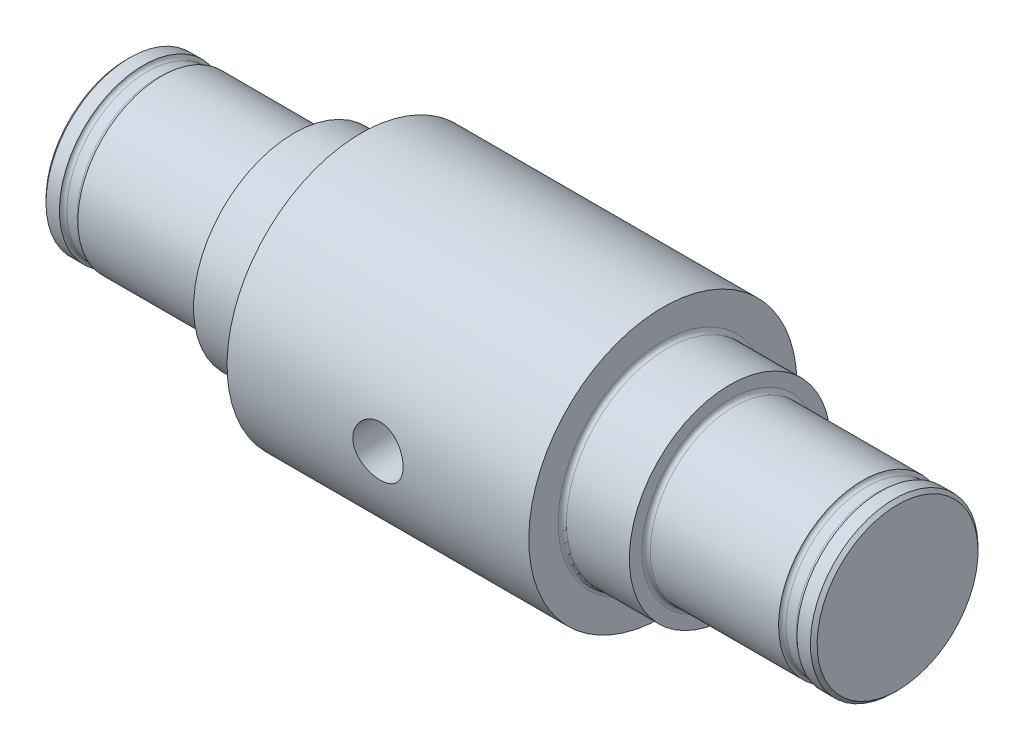
ISO-10303-21;
HEADER;
FILE_DESCRIPTION(('STEP AP214'),'2;1');
FILE_NAME('part.step','',(''),(''),'','','');
FILE_SCHEMA(('AUTOMOTIVE_DESIGN { 1 0 10303 214 1 1 1 1 }'));
ENDSEC;
DATA;
#1=APPLICATION_CONTEXT('core data for automotive mechanical design processes');
#2=APPLICATION_PROTOCOL_DEFINITION('international standard','automotive_design',2000,#1);
#3=PRODUCT_CONTEXT('',#1,'mechanical');
#4=PRODUCT('Part','Part','',(#3));
#5=PRODUCT_RELATED_PRODUCT_CATEGORY('part','',(#4));
#6=PRODUCT_DEFINITION_FORMATION('','',#4);
#7=PRODUCT_DEFINITION_CONTEXT('part definition',#1,'design');
#8=PRODUCT_DEFINITION('design','',#6,#7);
#9=PRODUCT_DEFINITION_SHAPE('','',#8);
#10=(LENGTH_UNIT() NAMED_UNIT(*) SI_UNIT(.MILLI.,.METRE.));
#11=(NAMED_UNIT(*) PLANE_ANGLE_UNIT() SI_UNIT($,.RADIAN.));
#12=(NAMED_UNIT(*) SI_UNIT($,.STERADIAN.) SOLID_ANGLE_UNIT());
#13=UNCERTAINTY_MEASURE_WITH_UNIT(LENGTH_MEASURE(1.E-05),#10,'distance_accuracy_value','');
#14=(GEOMETRIC_REPRESENTATION_CONTEXT(3) GLOBAL_UNCERTAINTY_ASSIGNED_CONTEXT((#13)) GLOBAL_UNIT_ASSIGNED_CONTEXT((#10,
#11,#12)) REPRESENTATION_CONTEXT('',''));
#15=CARTESIAN_POINT('',(0.,0.,0.));
#16=DIRECTION('',(0.,0.,1.));
#17=DIRECTION('',(1.,0.,0.));
#18=AXIS2_PLACEMENT_3D('',#15,#16,#17);
#19=CARTESIAN_POINT('',(-55.3257242781672,0.,0.));
#20=DIRECTION('',(-1.,0.,0.));
#21=DIRECTION('',(0.,-1.,0.));
#22=AXIS2_PLACEMENT_3D('',#19,#20,#21);
#23=CYLINDRICAL_SURFACE('',#22,5.00000000000005);
#24=CARTESIAN_POINT('',(22.8,0.,0.));
#25=DIRECTION('',(-1.,0.,0.));
#26=DIRECTION('',(0.,-1.,0.));
#27=AXIS2_PLACEMENT_3D('',#24,#25,#26);
#28=CIRCLE('',#27,5.00000000000005);
#29=CARTESIAN_POINT('',(22.8,-5.00000000000007,0.));
#30=VERTEX_POINT('',#29);
#31=EDGE_CURVE('E60',#30,#30,#28,.T.);
#32=ORIENTED_EDGE('',*,*,#31,.T.);
#33=EDGE_LOOP('',(#32));
#34=FACE_BOUND('',#33,.T.);
#35=CARTESIAN_POINT('',(22.,0.,0.));
#36=DIRECTION('',(-1.,0.,0.));
#37=DIRECTION('',(0.,-1.,0.));
#38=AXIS2_PLACEMENT_3D('',#35,#36,#37);
#39=CIRCLE('',#38,5.00000000000005);
#40=CARTESIAN_POINT('',(22.,-5.00000000000007,0.));
#41=VERTEX_POINT('',#40);
#42=EDGE_CURVE('E384',#41,#41,#39,.T.);
#43=ORIENTED_EDGE('',*,*,#42,.F.);
#44=EDGE_LOOP('',(#43));
#45=FACE_BOUND('',#44,.T.);
#46=ADVANCED_FACE('F44',(#34,#45),#23,.T.);
#47=CARTESIAN_POINT('',(-55.3257242781672,0.,0.));
#48=DIRECTION('',(-1.,0.,0.));
#49=DIRECTION('',(0.,-1.,0.));
#50=AXIS2_PLACEMENT_3D('',#47,#48,#49);
#51=CYLINDRICAL_SURFACE('',#50,4.80000000000006);
#52=CARTESIAN_POINT('',(21.7550510257217,0.,0.));
#53=DIRECTION('',(1.,0.,0.));
#54=DIRECTION('',(0.,1.,0.));
#55=AXIS2_PLACEMENT_3D('',#52,#53,#54);
#56=CIRCLE('',#55,4.80000000000006);
#57=CARTESIAN_POINT('',(21.7550510257217,4.80000000000004,0.));
#58=VERTEX_POINT('',#57);
#59=EDGE_CURVE('E95',#58,#58,#56,.F.);
#60=ORIENTED_EDGE('',*,*,#59,.T.);
#61=EDGE_LOOP('',(#60));
#62=FACE_BOUND('',#61,.T.);
#63=CARTESIAN_POINT('',(21.1449489742783,0.,0.));
#64=DIRECTION('',(-1.,0.,0.));
#65=DIRECTION('',(0.,-1.,0.));
#66=AXIS2_PLACEMENT_3D('',#63,#64,#65);
#67=CIRCLE('',#66,4.80000000000006);
#68=CARTESIAN_POINT('',(21.1449489742783,-4.80000000000009,0.));
#69=VERTEX_POINT('',#68);
#70=EDGE_CURVE('E98',#69,#69,#67,.F.);
#71=ORIENTED_EDGE('',*,*,#70,.T.);
#72=EDGE_LOOP('',(#71));
#73=FACE_BOUND('',#72,.T.);
#74=ADVANCED_FACE('F161',(#62,#73),#51,.T.);
#75=CARTESIAN_POINT('',(-55.3257242781672,0.,0.));
#76=DIRECTION('',(-1.,0.,0.));
#77=DIRECTION('',(0.,-1.,0.));
#78=AXIS2_PLACEMENT_3D('',#75,#76,#77);
#79=CYLINDRICAL_SURFACE('',#78,5.00000000000003);
#80=CARTESIAN_POINT('',(13.25,0.,0.));
#81=DIRECTION('',(-1.,0.,0.));
#82=DIRECTION('',(0.,-1.,0.));
#83=AXIS2_PLACEMENT_3D('',#80,#81,#82);
#84=CIRCLE('',#83,5.00000000000003);
#85=CARTESIAN_POINT('',(13.25,-5.00000000000005,0.));
#86=VERTEX_POINT('',#85);
#87=EDGE_CURVE('E65',#86,#86,#84,.F.);
#88=ORIENTED_EDGE('',*,*,#87,.T.);
#89=EDGE_LOOP('',(#88));
#90=FACE_BOUND('',#89,.T.);
#91=CARTESIAN_POINT('',(20.9,0.,0.));
#92=DIRECTION('',(-1.,0.,0.));
#93=DIRECTION('',(0.,-1.,0.));
#94=AXIS2_PLACEMENT_3D('',#91,#92,#93);
#95=CIRCLE('',#94,5.00000000000003);
#96=CARTESIAN_POINT('',(20.9,-5.00000000000005,0.));
#97=VERTEX_POINT('',#96);
#98=EDGE_CURVE('E382',#97,#97,#95,.T.);
#99=ORIENTED_EDGE('',*,*,#98,.T.);
#100=EDGE_LOOP('',(#99));
#101=FACE_BOUND('',#100,.T.);
#102=ADVANCED_FACE('F168',(#90,#101),#79,.T.);
#103=CARTESIAN_POINT('',(13.,6.00000000000001,0.));
#104=DIRECTION('',(-1.,0.,0.));
#105=DIRECTION('',(0.,-1.,0.));
#106=AXIS2_PLACEMENT_3D('',#103,#104,#105);
#107=PLANE('',#106);
#108=CARTESIAN_POINT('',(13.,0.,0.));
#109=DIRECTION('',(-1.,0.,0.));
#110=DIRECTION('',(0.,-1.,0.));
#111=AXIS2_PLACEMENT_3D('',#108,#109,#110);
#112=CIRCLE('',#111,5.25000000000003);
#113=CARTESIAN_POINT('',(13.,-5.25000000000005,0.));
#114=VERTEX_POINT('',#113);
#115=EDGE_CURVE('E68',#114,#114,#112,.T.);
#116=ORIENTED_EDGE('',*,*,#115,.T.);
#117=EDGE_LOOP('',(#116));
#118=FACE_BOUND('',#117,.T.);
#119=CARTESIAN_POINT('',(13.,0.,0.));
#120=DIRECTION('',(-1.,0.,0.));
#121=DIRECTION('',(0.,-1.,0.));
#122=AXIS2_PLACEMENT_3D('',#119,#120,#121);
#123=CIRCLE('',#122,6.00000000000003);
#124=CARTESIAN_POINT('',(13.,-6.00000000000005,0.));
#125=VERTEX_POINT('',#124);
#126=EDGE_CURVE('E385',#125,#125,#123,.T.);
#127=ORIENTED_EDGE('',*,*,#126,.F.);
#128=EDGE_LOOP('',(#127));
#129=FACE_BOUND('',#128,.T.);
#130=ADVANCED_FACE('F348',(#118,#129),#107,.F.);
#131=CARTESIAN_POINT('',(-55.3257242781672,0.,0.));
#132=DIRECTION('',(-1.,0.,0.));
#133=DIRECTION('',(0.,-1.,0.));
#134=AXIS2_PLACEMENT_3D('',#131,#132,#133);
#135=CYLINDRICAL_SURFACE('',#134,6.00000000000002);
#136=CARTESIAN_POINT('',(9.25000000000001,0.,0.));
#137=DIRECTION('',(-1.,0.,0.));
#138=DIRECTION('',(0.,-1.,0.));
#139=AXIS2_PLACEMENT_3D('',#136,#137,#138);
#140=CIRCLE('',#139,6.00000000000002);
#141=CARTESIAN_POINT('',(9.25000000000001,-6.00000000000004,0.));
#142=VERTEX_POINT('',#141);
#143=EDGE_CURVE('E83',#142,#142,#140,.F.);
#144=ORIENTED_EDGE('',*,*,#143,.T.);
#145=EDGE_LOOP('',(#144));
#146=FACE_BOUND('',#145,.T.);
#147=ORIENTED_EDGE('',*,*,#126,.T.);
#148=EDGE_LOOP('',(#147));
#149=FACE_BOUND('',#148,.T.);
#150=ADVANCED_FACE('F339',(#146,#149),#135,.T.);
#151=CARTESIAN_POINT('',(9.,8.,0.));
#152=DIRECTION('',(-1.,0.,0.));
#153=DIRECTION('',(0.,-1.,0.));
#154=AXIS2_PLACEMENT_3D('',#151,#152,#153);
#155=PLANE('',#154);
#156=CARTESIAN_POINT('',(9.,0.,0.));
#157=DIRECTION('',(-1.,0.,0.));
#158=DIRECTION('',(0.,-1.,0.));
#159=AXIS2_PLACEMENT_3D('',#156,#157,#158);
#160=CIRCLE('',#159,6.25000000000002);
#161=CARTESIAN_POINT('',(9.,-6.25000000000004,0.));
#162=VERTEX_POINT('',#161);
#163=EDGE_CURVE('E86',#162,#162,#160,.T.);
#164=ORIENTED_EDGE('',*,*,#163,.T.);
#165=EDGE_LOOP('',(#164));
#166=FACE_BOUND('',#165,.T.);
#167=CARTESIAN_POINT('',(9.00000000000001,0.,0.));
#168=DIRECTION('',(-1.,0.,0.));
#169=DIRECTION('',(0.,-1.,0.));
#170=AXIS2_PLACEMENT_3D('',#167,#168,#169);
#171=CIRCLE('',#170,8.00000000000002);
#172=CARTESIAN_POINT('',(9.00000000000001,-8.00000000000004,0.));
#173=VERTEX_POINT('',#172);
#174=EDGE_CURVE('E389',#173,#173,#171,.T.);
#175=ORIENTED_EDGE('',*,*,#174,.F.);
#176=EDGE_LOOP('',(#175));
#177=FACE_BOUND('',#176,.T.);
#178=ADVANCED_FACE('F157',(#166,#177),#155,.F.);
#179=CARTESIAN_POINT('',(-55.3257242781672,0.,0.));
#180=DIRECTION('',(-1.,0.,0.));
#181=DIRECTION('',(0.,-1.,0.));
#182=AXIS2_PLACEMENT_3D('',#179,#180,#181);
#183=CYLINDRICAL_SURFACE('',#182,8.00000000000002);
#184=CARTESIAN_POINT('',(1.50000000000001,0.,-8.00000000000002));
#185=CARTESIAN_POINT('',(1.49999681041173,0.0834717464654708,-7.99999848833854));
#186=CARTESIAN_POINT('',(1.49300892338063,0.166984992730098,-7.99868009921716));
#187=CARTESIAN_POINT('',(1.46526000488166,0.331658129841798,-7.99354785890522));
#188=CARTESIAN_POINT('',(1.44448734936027,0.412815974152226,-7.98973190166899));
#189=CARTESIAN_POINT('',(1.38982729874067,0.570372961851802,-7.9800313876546));
#190=CARTESIAN_POINT('',(1.35595174754746,0.646776330685344,-7.97414869946485));
#191=CARTESIAN_POINT('',(1.27608112307719,0.792807973094007,-7.96095710599785));
#192=CARTESIAN_POINT('',(1.23008703085519,0.862436794477323,-7.95364831618291));
#193=CARTESIAN_POINT('',(1.12670023199633,0.993783715930503,-7.93831336430506));
#194=CARTESIAN_POINT('',(1.06919055532987,1.05540895503183,-7.93028034856353));
#195=CARTESIAN_POINT('',(0.944656690912446,1.16819606135369,-7.91445318458652));
#196=CARTESIAN_POINT('',(0.877631820230721,1.21935717689242,-7.90665905354529));
#197=CARTESIAN_POINT('',(0.735313911636036,1.31014998665793,-7.89212551245007));
#198=CARTESIAN_POINT('',(0.65995962968277,1.34968721969605,-7.88539493886184));
#199=CARTESIAN_POINT('',(0.503531084823217,1.41550524332283,-7.87384713211989));
#200=CARTESIAN_POINT('',(0.422457315888789,1.44178717713098,-7.86902973396964));
#201=CARTESIAN_POINT('',(0.257884769085595,1.480050535035,-7.86192269574552));
#202=CARTESIAN_POINT('',(0.174424902796542,1.49219390192039,-7.85960445366406));
#203=CARTESIAN_POINT('',(0.00662261519175826,1.50233808095346,-7.85767197152763));
#204=CARTESIAN_POINT('',(-0.0777197263022954,1.50034016135374,-7.85805748898761));
#205=CARTESIAN_POINT('',(-0.24371952526604,1.48238979602362,-7.86146292701755));
#206=CARTESIAN_POINT('',(-0.325397714300148,1.46662149996045,-7.86444808147336));
#207=CARTESIAN_POINT('',(-0.484928419782602,1.42186799396207,-7.87266183284668));
#208=CARTESIAN_POINT('',(-0.562780773509294,1.39288222239499,-7.87789052509518));
#209=CARTESIAN_POINT('',(-0.712988679000258,1.322336471793,-7.8900385529259));
#210=CARTESIAN_POINT('',(-0.785308470580802,1.28070213532456,-7.89696783823367));
#211=CARTESIAN_POINT('',(-0.922004728540227,1.18609368930416,-7.9117297160292));
#212=CARTESIAN_POINT('',(-0.986380387714794,1.13311842889266,-7.91956240015524));
#213=CARTESIAN_POINT('',(-1.10642495567245,1.01633905685298,-7.93540001272166));
#214=CARTESIAN_POINT('',(-1.16194065245174,0.952377436860682,-7.94340571024032));
#215=CARTESIAN_POINT('',(-1.2614772406754,0.815968037098826,-7.9585738610832));
#216=CARTESIAN_POINT('',(-1.30549801687041,0.743520172255769,-7.96573630595247));
#217=CARTESIAN_POINT('',(-1.38081775387001,0.592034988874668,-7.97842539677511));
#218=CARTESIAN_POINT('',(-1.41210077911789,0.512989564446493,-7.98394999136291));
#219=CARTESIAN_POINT('',(-1.46090209309215,0.350639115398696,-7.99272505402721));
#220=CARTESIAN_POINT('',(-1.47842184404535,0.267334544277786,-7.99597576367996));
#221=CARTESIAN_POINT('',(-1.49898603101826,0.100148652903384,-7.99980360641982));
#222=CARTESIAN_POINT('',(-1.50224039152972,0.0162940126341345,-8.00041950912281));
#223=CARTESIAN_POINT('',(-1.49474452045234,-0.150761248092185,-7.9990154359823));
#224=CARTESIAN_POINT('',(-1.48399497693473,-0.233961900480386,-7.99699558964433));
#225=CARTESIAN_POINT('',(-1.44897096481663,-0.396681573218218,-7.99057111500408));
#226=CARTESIAN_POINT('',(-1.42480271746218,-0.476224261046064,-7.98618522374033));
#227=CARTESIAN_POINT('',(-1.36374229322121,-0.630128631824634,-7.97551842212501));
#228=CARTESIAN_POINT('',(-1.32684925243421,-0.704489962595104,-7.96923738311336));
#229=CARTESIAN_POINT('',(-1.24092187184048,-0.846816671513215,-7.95538030357668));
#230=CARTESIAN_POINT('',(-1.19175926146315,-0.914703277015122,-7.94779086174565));
#231=CARTESIAN_POINT('',(-1.08286186263763,-1.04133832326455,-7.93219343489714));
#232=CARTESIAN_POINT('',(-1.02312608699866,-1.10008590976087,-7.92418541084689));
#233=CARTESIAN_POINT('',(-0.893827681088566,-1.20757295872048,-7.90852475697452));
#234=CARTESIAN_POINT('',(-0.824145091874606,-1.25616916218577,-7.90087825860259));
#235=CARTESIAN_POINT('',(-0.677482375476242,-1.34096675057787,-7.88692985578534));
#236=CARTESIAN_POINT('',(-0.60050251962952,-1.37716859613924,-7.88062790137352));
#237=CARTESIAN_POINT('',(-0.441794132757456,-1.43594673512823,-7.87013024209576));
#238=CARTESIAN_POINT('',(-0.36009062044066,-1.45858868794786,-7.8659244043688));
#239=CARTESIAN_POINT('',(-0.193952777478591,-1.48980679326235,-7.86007203802417));
#240=CARTESIAN_POINT('',(-0.109518756029591,-1.49838453270708,-7.85842522065792));
#241=CARTESIAN_POINT('',(0.0582483314415205,-1.50117762148355,-7.8578919980386));
#242=CARTESIAN_POINT('',(0.141577580957003,-1.49561895003499,-7.85896215974296));
#243=CARTESIAN_POINT('',(0.306091422045296,-1.47079175378803,-7.8636460066));
#244=CARTESIAN_POINT('',(0.387276026427448,-1.45152331089332,-7.86725967655749));
#245=CARTESIAN_POINT('',(0.545074484795488,-1.39991887583263,-7.87660508023182));
#246=CARTESIAN_POINT('',(0.621696591345777,-1.36760735397252,-7.88233284594967));
#247=CARTESIAN_POINT('',(0.768468254240851,-1.29085868912204,-7.89526387551842));
#248=CARTESIAN_POINT('',(0.838617352844789,-1.24642068948186,-7.90246724360122));
#249=CARTESIAN_POINT('',(0.971583680042302,-1.14589487339535,-7.91767266107747));
#250=CARTESIAN_POINT('',(1.03427541256711,-1.08964259864303,-7.92568505353045));
#251=CARTESIAN_POINT('',(1.14940516246453,-0.967427926742289,-7.94152833918737));
#252=CARTESIAN_POINT('',(1.20184082098014,-0.901463301891614,-7.9493591902733));
#253=CARTESIAN_POINT('',(1.29541095262707,-0.760984945071871,-7.96403975968051));
#254=CARTESIAN_POINT('',(1.33643942849065,-0.686399590640515,-7.97088000990563));
#255=CARTESIAN_POINT('',(1.40531763660514,-0.531290113653833,-7.98271619380688));
#256=CARTESIAN_POINT('',(1.43317974704692,-0.450771651705247,-7.98771385879039));
#257=CARTESIAN_POINT('',(1.46927731441868,-0.308347202825153,-7.99428290707634));
#258=CARTESIAN_POINT('',(1.48077863031281,-0.24727381025187,-7.99641470878208));
#259=CARTESIAN_POINT('',(1.49614106211645,-0.124141247115158,-7.99927379954012));
#260=CARTESIAN_POINT('',(1.50000237225591,-0.0620821016527094,-8.00000112429807));
#261=CARTESIAN_POINT('',(1.50000000000001,0.,-8.00000000000002));
#262=B_SPLINE_CURVE_WITH_KNOTS('',3,(#184,#185,#186,#187,#188,#189,#190,#191,#192,#193,#194,
#195,#196,#197,#198,#199,#200,#201,#202,#203,#204,#205,#206,#207,#208,#209,#210,#211,#212,#213,
#214,#215,#216,#217,#218,#219,#220,#221,#222,#223,#224,#225,#226,#227,#228,#229,#230,#231,#232,
#233,#234,#235,#236,#237,#238,#239,#240,#241,#242,#243,#244,#245,#246,#247,#248,#249,#250,#251,
#252,#253,#254,#255,#256,#257,#258,#259,#260,#261),.UNSPECIFIED.,.T.,.F.,(4,2,2,2,2,2,2,2,2,2,2,
2,2,2,2,2,2,2,2,2,2,2,2,2,2,2,2,2,2,2,2,2,2,2,2,2,2,2,4),(0.,0.250188200964924,
0.500587642535452,0.750761271230908,1.00091465336891,1.25375118013631,1.50660586283617,
1.76146190504358,2.01629596311949,2.26818151445336,2.52004447587256,2.76859000612766,
3.01714609846787,3.26719262629531,3.51726454049859,3.77127768464077,4.02529337544948,
4.27962588321699,4.53393136673745,4.78448174076097,5.03501980464583,5.28360233907828,
5.53220175338032,5.78351778017708,6.03485728413098,6.28953436987299,6.54420198954945,
6.79762627818559,7.05102196946513,7.30039252231748,7.54976158541506,7.79866496207692,
8.04758592655423,8.3002336996638,8.55293951262255,8.80792048916314,9.06266126931173,
9.24874344524409,9.4348208903954),.UNSPECIFIED.);
#263=CARTESIAN_POINT('',(1.50000000000001,0.,-8.00000000000002));
#264=VERTEX_POINT('',#263);
#265=EDGE_CURVE('E101',#264,#264,#262,.T.);
#266=ORIENTED_EDGE('',*,*,#265,.T.);
#267=EDGE_LOOP('',(#266));
#268=FACE_BOUND('',#267,.T.);
#269=CARTESIAN_POINT('',(1.50000000000001,0.,8.00000000000002));
#270=CARTESIAN_POINT('',(1.49999681041173,-0.0834717464654875,7.99999848833854));
#271=CARTESIAN_POINT('',(1.49300892338062,-0.166984992730115,7.99868009921716));
#272=CARTESIAN_POINT('',(1.46526000488166,-0.331658129841814,7.99354785890522));
#273=CARTESIAN_POINT('',(1.44448734936027,-0.412815974152242,7.98973190166899));
#274=CARTESIAN_POINT('',(1.38982729874066,-0.570372961851817,7.9800313876546));
#275=CARTESIAN_POINT('',(1.35595174754746,-0.646776330685359,7.97414869946485));
#276=CARTESIAN_POINT('',(1.27608112307718,-0.792807973094021,7.96095710599785));
#277=CARTESIAN_POINT('',(1.23008703085518,-0.862436794477337,7.95364831618292));
#278=CARTESIAN_POINT('',(1.12670023199632,-0.993783715930515,7.93831336430506));
#279=CARTESIAN_POINT('',(1.06919055532986,-1.05540895503184,7.93028034856353));
#280=CARTESIAN_POINT('',(0.944656690912434,-1.1681960613537,7.91445318458652));
#281=CARTESIAN_POINT('',(0.877631820230708,-1.21935717689242,7.90665905354529));
#282=CARTESIAN_POINT('',(0.735313911636021,-1.31014998665794,7.89212551245008));
#283=CARTESIAN_POINT('',(0.659959629682755,-1.34968721969606,7.88539493886184));
#284=CARTESIAN_POINT('',(0.503531084823201,-1.41550524332284,7.8738471321199));
#285=CARTESIAN_POINT('',(0.422457315888774,-1.44178717713099,7.86902973396965));
#286=CARTESIAN_POINT('',(0.257884769085579,-1.480050535035,7.86192269574552));
#287=CARTESIAN_POINT('',(0.174424902796526,-1.49219390192039,7.85960445366407));
#288=CARTESIAN_POINT('',(0.00662261519174223,-1.50233808095346,7.85767197152764));
#289=CARTESIAN_POINT('',(-0.0777197263023115,-1.50034016135374,7.85805748898762));
#290=CARTESIAN_POINT('',(-0.243719525266056,-1.48238979602362,7.86146292701755));
#291=CARTESIAN_POINT('',(-0.325397714300164,-1.46662149996044,7.86444808147336));
#292=CARTESIAN_POINT('',(-0.484928419782618,-1.42186799396206,7.87266183284669));
#293=CARTESIAN_POINT('',(-0.562780773509309,-1.39288222239499,7.87789052509518));
#294=CARTESIAN_POINT('',(-0.712988679000273,-1.32233647179299,7.89003855292591));
#295=CARTESIAN_POINT('',(-0.785308470580817,-1.28070213532455,7.89696783823368));
#296=CARTESIAN_POINT('',(-0.92200472854024,-1.18609368930415,7.9117297160292));
#297=CARTESIAN_POINT('',(-0.986380387714807,-1.13311842889265,7.91956240015525));
#298=CARTESIAN_POINT('',(-1.10642495567246,-1.01633905685296,7.93540001272167));
#299=CARTESIAN_POINT('',(-1.16194065245175,-0.952377436860668,7.94340571024033));
#300=CARTESIAN_POINT('',(-1.26147724067541,-0.815968037098811,7.9585738610832));
#301=CARTESIAN_POINT('',(-1.30549801687042,-0.743520172255753,7.96573630595247));
#302=CARTESIAN_POINT('',(-1.38081775387002,-0.592034988874651,7.97842539677511));
#303=CARTESIAN_POINT('',(-1.41210077911789,-0.512989564446477,7.98394999136291));
#304=CARTESIAN_POINT('',(-1.46090209309216,-0.350639115398679,7.99272505402721));
#305=CARTESIAN_POINT('',(-1.47842184404535,-0.267334544277769,7.99597576367996));
#306=CARTESIAN_POINT('',(-1.49898603101826,-0.100148652903368,7.99980360641982));
#307=CARTESIAN_POINT('',(-1.50224039152972,-0.0162940126341179,8.00041950912281));
#308=CARTESIAN_POINT('',(-1.49474452045234,0.150761248092201,7.9990154359823));
#309=CARTESIAN_POINT('',(-1.48399497693473,0.233961900480402,7.99699558964433));
#310=CARTESIAN_POINT('',(-1.44897096481662,0.396681573218234,7.99057111500408));
#311=CARTESIAN_POINT('',(-1.42480271746217,0.47622426104608,7.98618522374032));
#312=CARTESIAN_POINT('',(-1.3637422932212,0.630128631824649,7.975518422125));
#313=CARTESIAN_POINT('',(-1.3268492524342,0.704489962595118,7.96923738311336));
#314=CARTESIAN_POINT('',(-1.24092187184047,0.846816671513228,7.95538030357668));
#315=CARTESIAN_POINT('',(-1.19175926146314,0.914703277015135,7.94779086174564));
#316=CARTESIAN_POINT('',(-1.08286186263762,1.04133832326456,7.93219343489713));
#317=CARTESIAN_POINT('',(-1.02312608699865,1.10008590976088,7.92418541084688));
#318=CARTESIAN_POINT('',(-0.893827681088553,1.20757295872049,7.90852475697452));
#319=CARTESIAN_POINT('',(-0.824145091874592,1.25616916218578,7.90087825860258));
#320=CARTESIAN_POINT('',(-0.677482375476227,1.34096675057788,7.88692985578533));
#321=CARTESIAN_POINT('',(-0.600502519629504,1.37716859613925,7.88062790137351));
#322=CARTESIAN_POINT('',(-0.44179413275744,1.43594673512823,7.87013024209575));
#323=CARTESIAN_POINT('',(-0.360090620440643,1.45858868794787,7.8659244043688));
#324=CARTESIAN_POINT('',(-0.193952777478574,1.48980679326236,7.86007203802417));
#325=CARTESIAN_POINT('',(-0.109518756029574,1.49838453270708,7.85842522065791));
#326=CARTESIAN_POINT('',(0.0582483314415371,1.50117762148355,7.85789199803859));
#327=CARTESIAN_POINT('',(0.14157758095702,1.49561895003499,7.85896215974295));
#328=CARTESIAN_POINT('',(0.306091422045312,1.47079175378803,7.8636460066));
#329=CARTESIAN_POINT('',(0.387276026427464,1.45152331089332,7.86725967655748));
#330=CARTESIAN_POINT('',(0.545074484795503,1.39991887583263,7.87660508023181));
#331=CARTESIAN_POINT('',(0.621696591345791,1.36760735397252,7.88233284594967));
#332=CARTESIAN_POINT('',(0.768468254240865,1.29085868912203,7.89526387551842));
#333=CARTESIAN_POINT('',(0.838617352844802,1.24642068948185,7.90246724360121));
#334=CARTESIAN_POINT('',(0.971583680042314,1.14589487339534,7.91767266107747));
#335=CARTESIAN_POINT('',(1.03427541256712,1.08964259864302,7.92568505353045));
#336=CARTESIAN_POINT('',(1.14940516246454,0.967427926742278,7.94152833918737));
#337=CARTESIAN_POINT('',(1.20184082098015,0.901463301891603,7.9493591902733));
#338=CARTESIAN_POINT('',(1.29541095262708,0.760984945071859,7.96403975968051));
#339=CARTESIAN_POINT('',(1.33643942849065,0.686399590640502,7.97088000990563));
#340=CARTESIAN_POINT('',(1.40531763660515,0.531290113653819,7.98271619380688));
#341=CARTESIAN_POINT('',(1.43317974704692,0.450771651705232,7.98771385879039));
#342=CARTESIAN_POINT('',(1.46927731441868,0.308347202825138,7.99428290707634));
#343=CARTESIAN_POINT('',(1.48077863031281,0.247273810251855,7.99641470878208));
#344=CARTESIAN_POINT('',(1.49614106211646,0.124141247115142,7.99927379954012));
#345=CARTESIAN_POINT('',(1.50000237225592,0.0620821016526933,8.00000112429807));
#346=CARTESIAN_POINT('',(1.50000000000001,0.,8.00000000000002));
#347=B_SPLINE_CURVE_WITH_KNOTS('',3,(#269,#270,#271,#272,#273,#274,#275,#276,#277,#278,#279,
#280,#281,#282,#283,#284,#285,#286,#287,#288,#289,#290,#291,#292,#293,#294,#295,#296,#297,#298,
#299,#300,#301,#302,#303,#304,#305,#306,#307,#308,#309,#310,#311,#312,#313,#314,#315,#316,#317,
#318,#319,#320,#321,#322,#323,#324,#325,#326,#327,#328,#329,#330,#331,#332,#333,#334,#335,#336,
#337,#338,#339,#340,#341,#342,#343,#344,#345,#346),.UNSPECIFIED.,.T.,.F.,(4,2,2,2,2,2,2,2,2,2,2,
2,2,2,2,2,2,2,2,2,2,2,2,2,2,2,2,2,2,2,2,2,2,2,2,2,2,2,4),(0.,0.250188200964924,
0.500587642535452,0.750761271230907,1.00091465336891,1.25375118013631,1.50660586283617,
1.76146190504358,2.01629596311949,2.26818151445336,2.52004447587256,2.76859000612766,
3.01714609846787,3.26719262629531,3.5172645404986,3.77127768464077,4.02529337544948,
4.27962588321699,4.53393136673745,4.78448174076097,5.03501980464583,5.28360233907828,
5.53220175338032,5.78351778017708,6.03485728413098,6.28953436987299,6.54420198954945,
6.79762627818559,7.05102196946513,7.30039252231748,7.54976158541507,7.79866496207692,
8.04758592655423,8.3002336996638,8.55293951262255,8.80792048916314,9.06266126931173,
9.24874344524409,9.43482089039541),.UNSPECIFIED.);
#348=CARTESIAN_POINT('',(1.50000000000001,0.,8.00000000000002));
#349=VERTEX_POINT('',#348);
#350=EDGE_CURVE('E109',#349,#349,#347,.T.);
#351=ORIENTED_EDGE('',*,*,#350,.T.);
#352=EDGE_LOOP('',(#351));
#353=FACE_BOUND('',#352,.T.);
#354=CARTESIAN_POINT('',(-8.99999999999999,0.,0.));
#355=DIRECTION('',(-1.,0.,0.));
#356=DIRECTION('',(0.,-1.,0.));
#357=AXIS2_PLACEMENT_3D('',#354,#355,#356);
#358=CIRCLE('',#357,8.00000000000002);
#359=CARTESIAN_POINT('',(-9.,-8.00000000000003,0.));
#360=VERTEX_POINT('',#359);
#361=EDGE_CURVE('E394',#360,#360,#358,.T.);
#362=ORIENTED_EDGE('',*,*,#361,.F.);
#363=EDGE_LOOP('',(#362));
#364=FACE_BOUND('',#363,.T.);
#365=ORIENTED_EDGE('',*,*,#174,.T.);
#366=EDGE_LOOP('',(#365));
#367=FACE_BOUND('',#366,.T.);
#368=ADVANCED_FACE('F114',(#268,#353,#364,#367),#183,.T.);
#369=CARTESIAN_POINT('',(-9.,6.,0.));
#370=DIRECTION('',(1.,0.,0.));
#371=DIRECTION('',(0.,1.,0.));
#372=AXIS2_PLACEMENT_3D('',#369,#370,#371);
#373=PLANE('',#372);
#374=CARTESIAN_POINT('',(-9.,0.,0.));
#375=DIRECTION('',(1.,0.,0.));
#376=DIRECTION('',(0.,1.,0.));
#377=AXIS2_PLACEMENT_3D('',#374,#375,#376);
#378=CIRCLE('',#377,6.25000000000001);
#379=CARTESIAN_POINT('',(-9.,6.25,0.));
#380=VERTEX_POINT('',#379);
#381=EDGE_CURVE('E71',#380,#380,#378,.T.);
#382=ORIENTED_EDGE('',*,*,#381,.T.);
#383=EDGE_LOOP('',(#382));
#384=FACE_BOUND('',#383,.T.);
#385=ORIENTED_EDGE('',*,*,#361,.T.);
#386=EDGE_LOOP('',(#385));
#387=FACE_BOUND('',#386,.T.);
#388=ADVANCED_FACE('F149',(#384,#387),#373,.F.);
#389=CARTESIAN_POINT('',(-55.3257242781672,0.,0.));
#390=DIRECTION('',(-1.,0.,0.));
#391=DIRECTION('',(0.,-1.,0.));
#392=AXIS2_PLACEMENT_3D('',#389,#390,#391);
#393=CYLINDRICAL_SURFACE('',#392,6.00000000000001);
#394=CARTESIAN_POINT('',(-9.24999999999999,0.,0.));
#395=DIRECTION('',(1.,0.,0.));
#396=DIRECTION('',(0.,1.,0.));
#397=AXIS2_PLACEMENT_3D('',#394,#395,#396);
#398=CIRCLE('',#397,6.00000000000001);
#399=CARTESIAN_POINT('',(-9.24999999999999,6.,0.));
#400=VERTEX_POINT('',#399);
#401=EDGE_CURVE('E74',#400,#400,#398,.F.);
#402=ORIENTED_EDGE('',*,*,#401,.T.);
#403=EDGE_LOOP('',(#402));
#404=FACE_BOUND('',#403,.T.);
#405=CARTESIAN_POINT('',(-13.,0.,0.));
#406=DIRECTION('',(-1.,0.,0.));
#407=DIRECTION('',(0.,-1.,0.));
#408=AXIS2_PLACEMENT_3D('',#405,#406,#407);
#409=CIRCLE('',#408,6.00000000000001);
#410=CARTESIAN_POINT('',(-13.,-6.00000000000002,0.));
#411=VERTEX_POINT('',#410);
#412=EDGE_CURVE('E397',#411,#411,#409,.T.);
#413=ORIENTED_EDGE('',*,*,#412,.F.);
#414=EDGE_LOOP('',(#413));
#415=FACE_BOUND('',#414,.T.);
#416=ADVANCED_FACE('F146',(#404,#415),#393,.T.);
#417=CARTESIAN_POINT('',(-13.,5.00000000000001,0.));
#418=DIRECTION('',(1.,0.,0.));
#419=DIRECTION('',(0.,1.,0.));
#420=AXIS2_PLACEMENT_3D('',#417,#418,#419);
#421=PLANE('',#420);
#422=CARTESIAN_POINT('',(-13.,0.,0.));
#423=DIRECTION('',(1.,0.,0.));
#424=DIRECTION('',(0.,1.,0.));
#425=AXIS2_PLACEMENT_3D('',#422,#423,#424);
#426=CIRCLE('',#425,5.25000000000002);
#427=CARTESIAN_POINT('',(-13.,5.25000000000001,0.));
#428=VERTEX_POINT('',#427);
#429=EDGE_CURVE('E77',#428,#428,#426,.T.);
#430=ORIENTED_EDGE('',*,*,#429,.T.);
#431=EDGE_LOOP('',(#430));
#432=FACE_BOUND('',#431,.T.);
#433=ORIENTED_EDGE('',*,*,#412,.T.);
#434=EDGE_LOOP('',(#433));
#435=FACE_BOUND('',#434,.T.);
#436=ADVANCED_FACE('F142',(#432,#435),#421,.F.);
#437=CARTESIAN_POINT('',(-55.3257242781672,0.,0.));
#438=DIRECTION('',(-1.,0.,0.));
#439=DIRECTION('',(0.,-1.,0.));
#440=AXIS2_PLACEMENT_3D('',#437,#438,#439);
#441=CYLINDRICAL_SURFACE('',#440,5.00000000000002);
#442=CARTESIAN_POINT('',(-13.25,0.,0.));
#443=DIRECTION('',(1.,0.,0.));
#444=DIRECTION('',(0.,1.,0.));
#445=AXIS2_PLACEMENT_3D('',#442,#443,#444);
#446=CIRCLE('',#445,5.00000000000002);
#447=CARTESIAN_POINT('',(-13.25,5.00000000000001,0.));
#448=VERTEX_POINT('',#447);
#449=EDGE_CURVE('E80',#448,#448,#446,.F.);
#450=ORIENTED_EDGE('',*,*,#449,.T.);
#451=EDGE_LOOP('',(#450));
#452=FACE_BOUND('',#451,.T.);
#453=CARTESIAN_POINT('',(-20.9,0.,0.));
#454=DIRECTION('',(-1.,0.,0.));
#455=DIRECTION('',(0.,-1.,0.));
#456=AXIS2_PLACEMENT_3D('',#453,#454,#455);
#457=CIRCLE('',#456,5.00000000000002);
#458=CARTESIAN_POINT('',(-20.9,-5.00000000000003,0.));
#459=VERTEX_POINT('',#458);
#460=EDGE_CURVE('E400',#459,#459,#457,.T.);
#461=ORIENTED_EDGE('',*,*,#460,.F.);
#462=EDGE_LOOP('',(#461));
#463=FACE_BOUND('',#462,.T.);
#464=ADVANCED_FACE('F138',(#452,#463),#441,.T.);
#465=CARTESIAN_POINT('',(-55.3257242781672,0.,0.));
#466=DIRECTION('',(-1.,0.,0.));
#467=DIRECTION('',(0.,-1.,0.));
#468=AXIS2_PLACEMENT_3D('',#465,#466,#467);
#469=CYLINDRICAL_SURFACE('',#468,4.80000000000001);
#470=CARTESIAN_POINT('',(-21.1449489742783,0.,0.));
#471=DIRECTION('',(1.,0.,0.));
#472=DIRECTION('',(0.,1.,0.));
#473=AXIS2_PLACEMENT_3D('',#470,#471,#472);
#474=CIRCLE('',#473,4.80000000000001);
#475=CARTESIAN_POINT('',(-21.1449489742783,4.8,0.));
#476=VERTEX_POINT('',#475);
#477=EDGE_CURVE('E89',#476,#476,#474,.F.);
#478=ORIENTED_EDGE('',*,*,#477,.T.);
#479=EDGE_LOOP('',(#478));
#480=FACE_BOUND('',#479,.T.);
#481=CARTESIAN_POINT('',(-21.7550510257217,0.,0.));
#482=DIRECTION('',(-1.,0.,0.));
#483=DIRECTION('',(0.,-1.,0.));
#484=AXIS2_PLACEMENT_3D('',#481,#482,#483);
#485=CIRCLE('',#484,4.80000000000001);
#486=CARTESIAN_POINT('',(-21.7550510257217,-4.80000000000002,0.));
#487=VERTEX_POINT('',#486);
#488=EDGE_CURVE('E92',#487,#487,#485,.F.);
#489=ORIENTED_EDGE('',*,*,#488,.T.);
#490=EDGE_LOOP('',(#489));
#491=FACE_BOUND('',#490,.T.);
#492=ADVANCED_FACE('F135',(#480,#491),#469,.T.);
#493=CARTESIAN_POINT('',(-55.3257242781672,0.,0.));
#494=DIRECTION('',(-1.,0.,0.));
#495=DIRECTION('',(0.,-1.,0.));
#496=AXIS2_PLACEMENT_3D('',#493,#494,#495);
#497=CYLINDRICAL_SURFACE('',#496,5.00000000000001);
#498=CARTESIAN_POINT('',(-22.8,0.,0.));
#499=DIRECTION('',(1.,0.,0.));
#500=DIRECTION('',(0.,1.,0.));
#501=AXIS2_PLACEMENT_3D('',#498,#499,#500);
#502=CIRCLE('',#501,5.00000000000001);
#503=CARTESIAN_POINT('',(-22.8,5.,0.));
#504=VERTEX_POINT('',#503);
#505=EDGE_CURVE('E10',#504,#504,#502,.T.);
#506=ORIENTED_EDGE('',*,*,#505,.T.);
#507=EDGE_LOOP('',(#506));
#508=FACE_BOUND('',#507,.T.);
#509=CARTESIAN_POINT('',(-22.,0.,0.));
#510=DIRECTION('',(-1.,0.,0.));
#511=DIRECTION('',(0.,-1.,0.));
#512=AXIS2_PLACEMENT_3D('',#509,#510,#511);
#513=CIRCLE('',#512,5.00000000000002);
#514=CARTESIAN_POINT('',(-22.,-5.00000000000002,0.));
#515=VERTEX_POINT('',#514);
#516=EDGE_CURVE('E403',#515,#515,#513,.T.);
#517=ORIENTED_EDGE('',*,*,#516,.T.);
#518=EDGE_LOOP('',(#517));
#519=FACE_BOUND('',#518,.T.);
#520=ADVANCED_FACE('F132',(#508,#519),#497,.T.);
#521=CARTESIAN_POINT('',(-23.,0.,0.));
#522=DIRECTION('',(1.,0.,0.));
#523=DIRECTION('',(0.,1.,0.));
#524=AXIS2_PLACEMENT_3D('',#521,#522,#523);
#525=PLANE('',#524);
#526=CARTESIAN_POINT('',(-23.,0.,0.));
#527=DIRECTION('',(1.,0.,0.));
#528=DIRECTION('',(0.,1.,0.));
#529=AXIS2_PLACEMENT_3D('',#526,#527,#528);
#530=CIRCLE('',#529,4.80000000000001);
#531=CARTESIAN_POINT('',(-23.,4.8,0.));
#532=VERTEX_POINT('',#531);
#533=EDGE_CURVE('E52',#532,#532,#530,.F.);
#534=ORIENTED_EDGE('',*,*,#533,.T.);
#535=EDGE_LOOP('',(#534));
#536=FACE_BOUND('',#535,.T.);
#537=ADVANCED_FACE('F128',(#536),#525,.F.);
#538=CARTESIAN_POINT('',(23.,0.,0.));
#539=DIRECTION('',(-1.,0.,0.));
#540=DIRECTION('',(0.,-1.,0.));
#541=AXIS2_PLACEMENT_3D('',#538,#539,#540);
#542=PLANE('',#541);
#543=CARTESIAN_POINT('',(23.,0.,0.));
#544=DIRECTION('',(-1.,0.,0.));
#545=DIRECTION('',(0.,-1.,0.));
#546=AXIS2_PLACEMENT_3D('',#543,#544,#545);
#547=CIRCLE('',#546,4.80000000000001);
#548=CARTESIAN_POINT('',(23.,-4.80000000000003,0.));
#549=VERTEX_POINT('',#548);
#550=EDGE_CURVE('E56',#549,#549,#547,.F.);
#551=ORIENTED_EDGE('',*,*,#550,.T.);
#552=EDGE_LOOP('',(#551));
#553=FACE_BOUND('',#552,.T.);
#554=ADVANCED_FACE('F123',(#553),#542,.F.);
#555=CARTESIAN_POINT('',(0.,0.,-8.00000000000002));
#556=DIRECTION('',(0.,0.,1.));
#557=DIRECTION('',(1.,0.,0.));
#558=AXIS2_PLACEMENT_3D('',#555,#556,#557);
#559=CYLINDRICAL_SURFACE('',#558,1.5);
#560=ORIENTED_EDGE('',*,*,#350,.F.);
#561=EDGE_LOOP('',(#560));
#562=FACE_BOUND('',#561,.T.);
#563=ORIENTED_EDGE('',*,*,#265,.F.);
#564=EDGE_LOOP('',(#563));
#565=FACE_BOUND('',#564,.T.);
#566=ADVANCED_FACE('F118',(#562,#565),#559,.F.);
#567=CARTESIAN_POINT('',(21.7550510257217,0.,0.));
#568=DIRECTION('',(1.,0.,0.));
#569=DIRECTION('',(0.,1.,0.));
#570=AXIS2_PLACEMENT_3D('',#567,#568,#569);
#571=TOROIDAL_SURFACE('',#570,5.05000000000006,0.25);
#572=ORIENTED_EDGE('',*,*,#42,.T.);
#573=EDGE_LOOP('',(#572));
#574=FACE_BOUND('',#573,.T.);
#575=ORIENTED_EDGE('',*,*,#59,.F.);
#576=EDGE_LOOP('',(#575));
#577=FACE_BOUND('',#576,.T.);
#578=ADVANCED_FACE('F122',(#574,#577),#571,.F.);
#579=CARTESIAN_POINT('',(21.1449489742783,0.,0.));
#580=DIRECTION('',(-1.,0.,0.));
#581=DIRECTION('',(0.,-1.,0.));
#582=AXIS2_PLACEMENT_3D('',#579,#580,#581);
#583=TOROIDAL_SURFACE('',#582,5.05000000000006,0.25);
#584=ORIENTED_EDGE('',*,*,#70,.F.);
#585=EDGE_LOOP('',(#584));
#586=FACE_BOUND('',#585,.T.);
#587=ORIENTED_EDGE('',*,*,#98,.F.);
#588=EDGE_LOOP('',(#587));
#589=FACE_BOUND('',#588,.T.);
#590=ADVANCED_FACE('F176',(#586,#589),#583,.F.);
#591=CARTESIAN_POINT('',(-21.1449489742783,0.,0.));
#592=DIRECTION('',(1.,0.,0.));
#593=DIRECTION('',(0.,1.,0.));
#594=AXIS2_PLACEMENT_3D('',#591,#592,#593);
#595=TOROIDAL_SURFACE('',#594,5.05000000000001,0.25);
#596=ORIENTED_EDGE('',*,*,#460,.T.);
#597=EDGE_LOOP('',(#596));
#598=FACE_BOUND('',#597,.T.);
#599=ORIENTED_EDGE('',*,*,#477,.F.);
#600=EDGE_LOOP('',(#599));
#601=FACE_BOUND('',#600,.T.);
#602=ADVANCED_FACE('F180',(#598,#601),#595,.F.);
#603=CARTESIAN_POINT('',(-21.7550510257217,0.,0.));
#604=DIRECTION('',(-1.,0.,0.));
#605=DIRECTION('',(0.,-1.,0.));
#606=AXIS2_PLACEMENT_3D('',#603,#604,#605);
#607=TOROIDAL_SURFACE('',#606,5.05000000000001,0.25);
#608=ORIENTED_EDGE('',*,*,#488,.F.);
#609=EDGE_LOOP('',(#608));
#610=FACE_BOUND('',#609,.T.);
#611=ORIENTED_EDGE('',*,*,#516,.F.);
#612=EDGE_LOOP('',(#611));
#613=FACE_BOUND('',#612,.T.);
#614=ADVANCED_FACE('F184',(#610,#613),#607,.F.);
#615=CARTESIAN_POINT('',(9.25000000000001,0.,0.));
#616=DIRECTION('',(-1.,0.,0.));
#617=DIRECTION('',(0.,-1.,0.));
#618=AXIS2_PLACEMENT_3D('',#615,#616,#617);
#619=TOROIDAL_SURFACE('',#618,6.25000000000002,0.25);
#620=ORIENTED_EDGE('',*,*,#143,.F.);
#621=EDGE_LOOP('',(#620));
#622=FACE_BOUND('',#621,.T.);
#623=ORIENTED_EDGE('',*,*,#163,.F.);
#624=EDGE_LOOP('',(#623));
#625=FACE_BOUND('',#624,.T.);
#626=ADVANCED_FACE('F188',(#622,#625),#619,.F.);
#627=CARTESIAN_POINT('',(-13.25,0.,0.));
#628=DIRECTION('',(1.,0.,0.));
#629=DIRECTION('',(0.,1.,0.));
#630=AXIS2_PLACEMENT_3D('',#627,#628,#629);
#631=TOROIDAL_SURFACE('',#630,5.25000000000002,0.25);
#632=ORIENTED_EDGE('',*,*,#429,.F.);
#633=EDGE_LOOP('',(#632));
#634=FACE_BOUND('',#633,.T.);
#635=ORIENTED_EDGE('',*,*,#449,.F.);
#636=EDGE_LOOP('',(#635));
#637=FACE_BOUND('',#636,.T.);
#638=ADVANCED_FACE('F192',(#634,#637),#631,.F.);
#639=CARTESIAN_POINT('',(-9.24999999999999,0.,0.));
#640=DIRECTION('',(1.,0.,0.));
#641=DIRECTION('',(0.,1.,0.));
#642=AXIS2_PLACEMENT_3D('',#639,#640,#641);
#643=TOROIDAL_SURFACE('',#642,6.25000000000001,0.25);
#644=ORIENTED_EDGE('',*,*,#381,.F.);
#645=EDGE_LOOP('',(#644));
#646=FACE_BOUND('',#645,.T.);
#647=ORIENTED_EDGE('',*,*,#401,.F.);
#648=EDGE_LOOP('',(#647));
#649=FACE_BOUND('',#648,.T.);
#650=ADVANCED_FACE('F196',(#646,#649),#643,.F.);
#651=CARTESIAN_POINT('',(13.25,0.,0.));
#652=DIRECTION('',(-1.,0.,0.));
#653=DIRECTION('',(0.,-1.,0.));
#654=AXIS2_PLACEMENT_3D('',#651,#652,#653);
#655=TOROIDAL_SURFACE('',#654,5.25000000000003,0.25);
#656=ORIENTED_EDGE('',*,*,#87,.F.);
#657=EDGE_LOOP('',(#656));
#658=FACE_BOUND('',#657,.T.);
#659=ORIENTED_EDGE('',*,*,#115,.F.);
#660=EDGE_LOOP('',(#659));
#661=FACE_BOUND('',#660,.T.);
#662=ADVANCED_FACE('F200',(#658,#661),#655,.F.);
#663=CARTESIAN_POINT('',(22.8,0.,0.));
#664=DIRECTION('',(-1.,0.,0.));
#665=DIRECTION('',(0.,-1.,0.));
#666=AXIS2_PLACEMENT_3D('',#663,#664,#665);
#667=CONICAL_SURFACE('',#666,5.00000000000005,0.78539816339747);
#668=ORIENTED_EDGE('',*,*,#550,.F.);
#669=EDGE_LOOP('',(#668));
#670=FACE_BOUND('',#669,.T.);
#671=ORIENTED_EDGE('',*,*,#31,.F.);
#672=EDGE_LOOP('',(#671));
#673=FACE_BOUND('',#672,.T.);
#674=ADVANCED_FACE('F202',(#670,#673),#667,.T.);
#675=CARTESIAN_POINT('',(-23.,0.,0.));
#676=DIRECTION('',(1.,0.,0.));
#677=DIRECTION('',(0.,1.,0.));
#678=AXIS2_PLACEMENT_3D('',#675,#676,#677);
#679=CONICAL_SURFACE('',#678,4.80000000000001,0.785398163397444);
#680=ORIENTED_EDGE('',*,*,#505,.F.);
#681=EDGE_LOOP('',(#680));
#682=FACE_BOUND('',#681,.T.);
#683=ORIENTED_EDGE('',*,*,#533,.F.);
#684=EDGE_LOOP('',(#683));
#685=FACE_BOUND('',#684,.T.);
#686=ADVANCED_FACE('F47',(#682,#685),#679,.T.);
#687=CLOSED_SHELL('',(#46,#74,#102,#130,#150,#178,#368,#388,#416,#436,#464,#492,#520,#537,#554,
#566,#578,#590,#602,#614,#626,#638,#650,#662,#674,#686));
#688=MANIFOLD_SOLID_BREP('B2',#687);
#689=ADVANCED_BREP_SHAPE_REPRESENTATION('',(#18,#688),#14);
#690=SHAPE_DEFINITION_REPRESENTATION(#9,#689);
ENDSEC;
END-ISO-10303-21;
